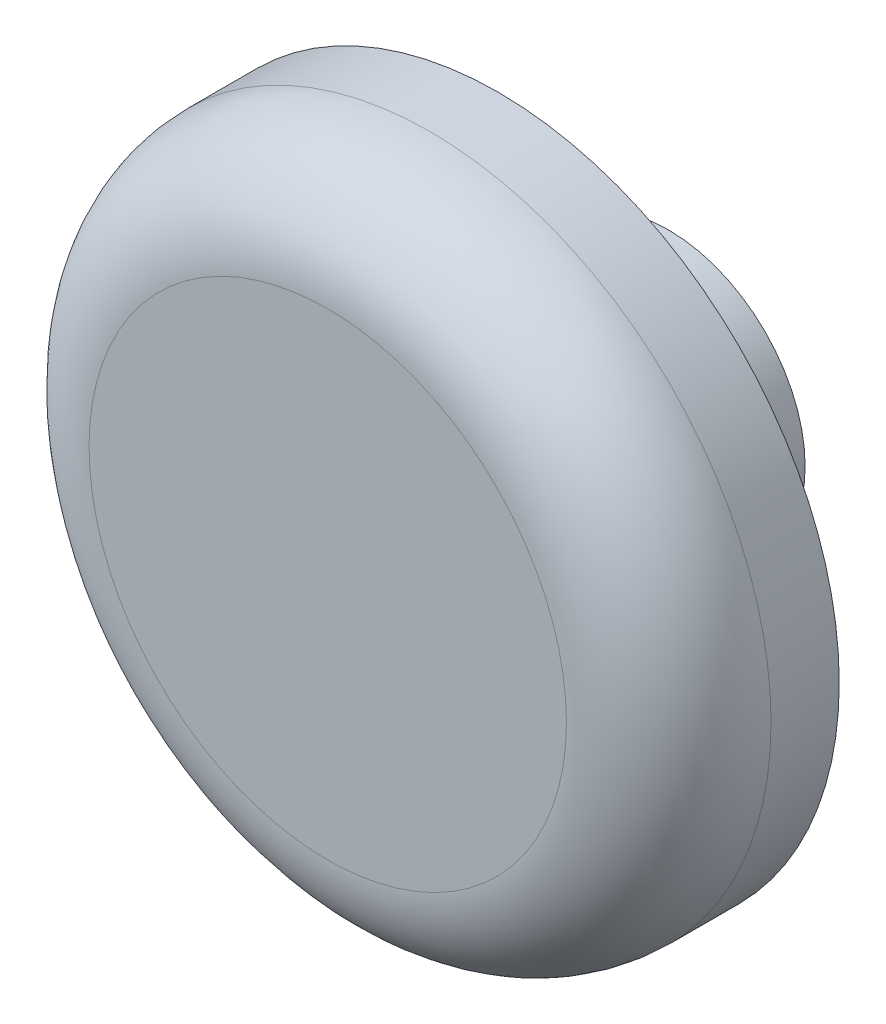
ISO-10303-21;
HEADER;
FILE_DESCRIPTION(('STEP AP214'),'2;1');
FILE_NAME('part.step','',(''),(''),'','','');
FILE_SCHEMA(('AUTOMOTIVE_DESIGN { 1 0 10303 214 1 1 1 1 }'));
ENDSEC;
DATA;
#1=APPLICATION_CONTEXT('core data for automotive mechanical design processes');
#2=APPLICATION_PROTOCOL_DEFINITION('international standard','automotive_design',2000,#1);
#3=PRODUCT_CONTEXT('',#1,'mechanical');
#4=PRODUCT('Part','Part','',(#3));
#5=PRODUCT_RELATED_PRODUCT_CATEGORY('part','',(#4));
#6=PRODUCT_DEFINITION_FORMATION('','',#4);
#7=PRODUCT_DEFINITION_CONTEXT('part definition',#1,'design');
#8=PRODUCT_DEFINITION('design','',#6,#7);
#9=PRODUCT_DEFINITION_SHAPE('','',#8);
#10=(LENGTH_UNIT() NAMED_UNIT(*) SI_UNIT(.MILLI.,.METRE.));
#11=(NAMED_UNIT(*) PLANE_ANGLE_UNIT() SI_UNIT($,.RADIAN.));
#12=(NAMED_UNIT(*) SI_UNIT($,.STERADIAN.) SOLID_ANGLE_UNIT());
#13=UNCERTAINTY_MEASURE_WITH_UNIT(LENGTH_MEASURE(1.E-05),#10,'distance_accuracy_value','');
#14=(GEOMETRIC_REPRESENTATION_CONTEXT(3) GLOBAL_UNCERTAINTY_ASSIGNED_CONTEXT((#13)) GLOBAL_UNIT_ASSIGNED_CONTEXT((#10,
#11,#12)) REPRESENTATION_CONTEXT('',''));
#15=CARTESIAN_POINT('',(0.,0.,0.));
#16=DIRECTION('',(0.,0.,1.));
#17=DIRECTION('',(1.,0.,0.));
#18=AXIS2_PLACEMENT_3D('',#15,#16,#17);
#19=CARTESIAN_POINT('',(0.,0.,0.));
#20=DIRECTION('',(0.,0.,1.));
#21=DIRECTION('',(1.,0.,0.));
#22=AXIS2_PLACEMENT_3D('',#19,#20,#21);
#23=CYLINDRICAL_SURFACE('',#22,4.);
#24=CARTESIAN_POINT('',(0.,0.,0.));
#25=DIRECTION('',(0.,0.,1.));
#26=DIRECTION('',(1.,0.,0.));
#27=AXIS2_PLACEMENT_3D('',#24,#25,#26);
#28=CIRCLE('',#27,4.);
#29=CARTESIAN_POINT('',(4.,0.,0.));
#30=VERTEX_POINT('',#29);
#31=EDGE_CURVE('E10',#30,#30,#28,.T.);
#32=ORIENTED_EDGE('',*,*,#31,.T.);
#33=EDGE_LOOP('',(#32));
#34=FACE_BOUND('',#33,.T.);
#35=CARTESIAN_POINT('',(0.,0.,5.));
#36=DIRECTION('',(0.,0.,1.));
#37=DIRECTION('',(1.,0.,0.));
#38=AXIS2_PLACEMENT_3D('',#35,#36,#37);
#39=CIRCLE('',#38,4.);
#40=CARTESIAN_POINT('',(4.,0.,5.));
#41=VERTEX_POINT('',#40);
#42=EDGE_CURVE('E50',#41,#41,#39,.T.);
#43=ORIENTED_EDGE('',*,*,#42,.F.);
#44=EDGE_LOOP('',(#43));
#45=FACE_BOUND('',#44,.T.);
#46=ADVANCED_FACE('F31',(#34,#45),#23,.T.);
#47=CARTESIAN_POINT('',(4.,0.,0.));
#48=DIRECTION('',(0.,0.,-1.));
#49=DIRECTION('',(-1.,0.,0.));
#50=AXIS2_PLACEMENT_3D('',#47,#48,#49);
#51=PLANE('',#50);
#52=ORIENTED_EDGE('',*,*,#31,.F.);
#53=EDGE_LOOP('',(#52));
#54=FACE_BOUND('',#53,.T.);
#55=ADVANCED_FACE('F58',(#54),#51,.T.);
#56=CARTESIAN_POINT('',(0.,0.,10.));
#57=DIRECTION('',(0.,0.,1.));
#58=DIRECTION('',(1.,0.,0.));
#59=AXIS2_PLACEMENT_3D('',#56,#57,#58);
#60=PLANE('',#59);
#61=CARTESIAN_POINT('',(0.,0.,10.));
#62=DIRECTION('',(0.,0.,1.));
#63=DIRECTION('',(1.,0.,0.));
#64=AXIS2_PLACEMENT_3D('',#61,#62,#63);
#65=CIRCLE('',#64,7.);
#66=CARTESIAN_POINT('',(7.,0.,10.));
#67=VERTEX_POINT('',#66);
#68=EDGE_CURVE('E37',#67,#67,#65,.T.);
#69=ORIENTED_EDGE('',*,*,#68,.T.);
#70=EDGE_LOOP('',(#69));
#71=FACE_BOUND('',#70,.T.);
#72=ADVANCED_FACE('F62',(#71),#60,.T.);
#73=CARTESIAN_POINT('',(0.,0.,7.));
#74=DIRECTION('',(0.,0.,1.));
#75=DIRECTION('',(1.,0.,0.));
#76=AXIS2_PLACEMENT_3D('',#73,#74,#75);
#77=TOROIDAL_SURFACE('',#76,7.,3.);
#78=CARTESIAN_POINT('',(0.,0.,7.));
#79=DIRECTION('',(0.,0.,1.));
#80=DIRECTION('',(1.,0.,0.));
#81=AXIS2_PLACEMENT_3D('',#78,#79,#80);
#82=CIRCLE('',#81,10.);
#83=CARTESIAN_POINT('',(10.,0.,7.));
#84=VERTEX_POINT('',#83);
#85=EDGE_CURVE('E41',#84,#84,#82,.T.);
#86=ORIENTED_EDGE('',*,*,#85,.T.);
#87=EDGE_LOOP('',(#86));
#88=FACE_BOUND('',#87,.T.);
#89=ORIENTED_EDGE('',*,*,#68,.F.);
#90=EDGE_LOOP('',(#89));
#91=FACE_BOUND('',#90,.T.);
#92=ADVANCED_FACE('F67',(#88,#91),#77,.T.);
#93=CARTESIAN_POINT('',(0.,0.,0.));
#94=DIRECTION('',(0.,0.,1.));
#95=DIRECTION('',(1.,0.,0.));
#96=AXIS2_PLACEMENT_3D('',#93,#94,#95);
#97=CYLINDRICAL_SURFACE('',#96,10.);
#98=CARTESIAN_POINT('',(0.,0.,5.));
#99=DIRECTION('',(0.,0.,1.));
#100=DIRECTION('',(1.,0.,0.));
#101=AXIS2_PLACEMENT_3D('',#98,#99,#100);
#102=CIRCLE('',#101,10.);
#103=CARTESIAN_POINT('',(10.,0.,5.));
#104=VERTEX_POINT('',#103);
#105=EDGE_CURVE('E45',#104,#104,#102,.T.);
#106=ORIENTED_EDGE('',*,*,#105,.T.);
#107=EDGE_LOOP('',(#106));
#108=FACE_BOUND('',#107,.T.);
#109=ORIENTED_EDGE('',*,*,#85,.F.);
#110=EDGE_LOOP('',(#109));
#111=FACE_BOUND('',#110,.T.);
#112=ADVANCED_FACE('F72',(#108,#111),#97,.T.);
#113=CARTESIAN_POINT('',(10.,0.,5.));
#114=DIRECTION('',(0.,0.,-1.));
#115=DIRECTION('',(-1.,0.,0.));
#116=AXIS2_PLACEMENT_3D('',#113,#114,#115);
#117=PLANE('',#116);
#118=ORIENTED_EDGE('',*,*,#42,.T.);
#119=EDGE_LOOP('',(#118));
#120=FACE_BOUND('',#119,.T.);
#121=ORIENTED_EDGE('',*,*,#105,.F.);
#122=EDGE_LOOP('',(#121));
#123=FACE_BOUND('',#122,.T.);
#124=ADVANCED_FACE('F54',(#120,#123),#117,.T.);
#125=CLOSED_SHELL('',(#46,#55,#72,#92,#112,#124));
#126=MANIFOLD_SOLID_BREP('B2',#125);
#127=ADVANCED_BREP_SHAPE_REPRESENTATION('',(#18,#126),#14);
#128=SHAPE_DEFINITION_REPRESENTATION(#9,#127);
ENDSEC;
END-ISO-10303-21;
